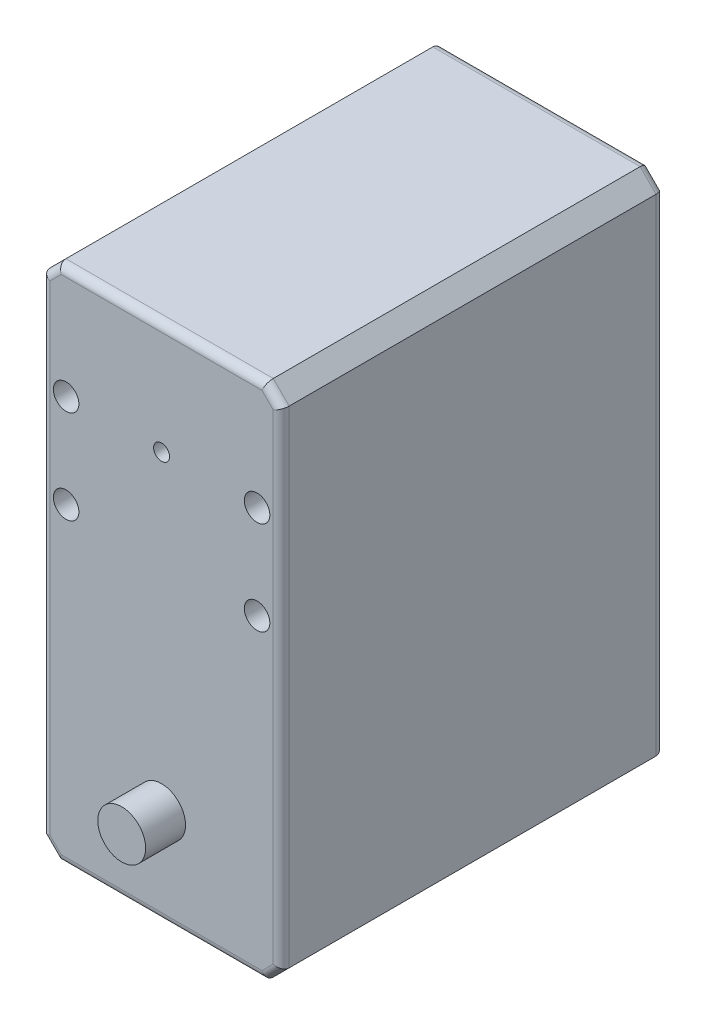
ISO-10303-21;
HEADER;
FILE_DESCRIPTION(('STEP AP214'),'2;1');
FILE_NAME('part.step','',(''),(''),'','','');
FILE_SCHEMA(('AUTOMOTIVE_DESIGN { 1 0 10303 214 1 1 1 1 }'));
ENDSEC;
DATA;
#1=APPLICATION_CONTEXT('core data for automotive mechanical design processes');
#2=APPLICATION_PROTOCOL_DEFINITION('international standard','automotive_design',2000,#1);
#3=PRODUCT_CONTEXT('',#1,'mechanical');
#4=PRODUCT('Part','Part','',(#3));
#5=PRODUCT_RELATED_PRODUCT_CATEGORY('part','',(#4));
#6=PRODUCT_DEFINITION_FORMATION('','',#4);
#7=PRODUCT_DEFINITION_CONTEXT('part definition',#1,'design');
#8=PRODUCT_DEFINITION('design','',#6,#7);
#9=PRODUCT_DEFINITION_SHAPE('','',#8);
#10=(LENGTH_UNIT() NAMED_UNIT(*) SI_UNIT(.MILLI.,.METRE.));
#11=(NAMED_UNIT(*) PLANE_ANGLE_UNIT() SI_UNIT($,.RADIAN.));
#12=(NAMED_UNIT(*) SI_UNIT($,.STERADIAN.) SOLID_ANGLE_UNIT());
#13=UNCERTAINTY_MEASURE_WITH_UNIT(LENGTH_MEASURE(1.E-05),#10,'distance_accuracy_value','');
#14=(GEOMETRIC_REPRESENTATION_CONTEXT(3) GLOBAL_UNCERTAINTY_ASSIGNED_CONTEXT((#13)) GLOBAL_UNIT_ASSIGNED_CONTEXT((#10,
#11,#12)) REPRESENTATION_CONTEXT('',''));
#15=CARTESIAN_POINT('',(0.,0.,0.));
#16=DIRECTION('',(0.,0.,1.));
#17=DIRECTION('',(1.,0.,0.));
#18=AXIS2_PLACEMENT_3D('',#15,#16,#17);
#19=CARTESIAN_POINT('',(0.,0.,48.));
#20=DIRECTION('',(0.,0.,1.));
#21=DIRECTION('',(1.,0.,0.));
#22=AXIS2_PLACEMENT_3D('',#19,#20,#21);
#23=PLANE('',#22);
#24=CARTESIAN_POINT('',(55.9991217398444,57.6069527072445,48.));
#25=DIRECTION('',(0.,0.,1.));
#26=DIRECTION('',(1.,0.,0.));
#27=AXIS2_PLACEMENT_3D('',#24,#25,#26);
#28=CIRCLE('',#27,1.59999999999986);
#29=CARTESIAN_POINT('',(57.5991217398443,57.6069527072445,48.));
#30=VERTEX_POINT('',#29);
#31=EDGE_CURVE('E263',#30,#30,#28,.T.);
#32=ORIENTED_EDGE('',*,*,#31,.F.);
#33=EDGE_LOOP('',(#32));
#34=FACE_BOUND('',#33,.T.);
#35=CARTESIAN_POINT('',(32.0547120458447,57.694813477697,48.));
#36=DIRECTION('',(0.,0.,1.));
#37=DIRECTION('',(1.,0.,0.));
#38=AXIS2_PLACEMENT_3D('',#35,#36,#37);
#39=CIRCLE('',#38,1.59999999999993);
#40=CARTESIAN_POINT('',(33.6547120458447,57.694813477697,48.));
#41=VERTEX_POINT('',#40);
#42=EDGE_CURVE('E742',#41,#41,#39,.T.);
#43=ORIENTED_EDGE('',*,*,#42,.F.);
#44=EDGE_LOOP('',(#43));
#45=FACE_BOUND('',#44,.T.);
#46=CARTESIAN_POINT('',(32.0547120458447,45.9674639761689,48.));
#47=DIRECTION('',(0.,0.,1.));
#48=DIRECTION('',(1.,0.,0.));
#49=AXIS2_PLACEMENT_3D('',#46,#47,#48);
#50=CIRCLE('',#49,1.59999999999993);
#51=CARTESIAN_POINT('',(33.6547120458447,45.9674639761689,48.));
#52=VERTEX_POINT('',#51);
#53=EDGE_CURVE('E745',#52,#52,#50,.T.);
#54=ORIENTED_EDGE('',*,*,#53,.F.);
#55=EDGE_LOOP('',(#54));
#56=FACE_BOUND('',#55,.T.);
#57=CARTESIAN_POINT('',(55.9991217398444,45.8796032057164,48.));
#58=DIRECTION('',(0.,0.,1.));
#59=DIRECTION('',(1.,0.,0.));
#60=AXIS2_PLACEMENT_3D('',#57,#58,#59);
#61=CIRCLE('',#60,1.59999999999986);
#62=CARTESIAN_POINT('',(57.5991217398443,45.8796032057164,48.));
#63=VERTEX_POINT('',#62);
#64=EDGE_CURVE('E748',#63,#63,#61,.T.);
#65=ORIENTED_EDGE('',*,*,#64,.F.);
#66=EDGE_LOOP('',(#65));
#67=FACE_BOUND('',#66,.T.);
#68=DIRECTION('',(-1.,0.,0.));
#69=VECTOR('',#68,1.);
#70=CARTESIAN_POINT('',(31.0269168928446,70.6508830924707,48.));
#71=LINE('',#70,#69);
#72=CARTESIAN_POINT('',(56.6127033304714,70.6508830924707,48.));
#73=VERTEX_POINT('',#72);
#74=CARTESIAN_POINT('',(31.4411304552177,70.6508830924707,48.));
#75=VERTEX_POINT('',#74);
#76=EDGE_CURVE('E191',#73,#75,#71,.T.);
#77=ORIENTED_EDGE('',*,*,#76,.T.);
#78=DIRECTION('',(0.707106781186552,0.707106781186543,0.));
#79=VECTOR('',#78,1.);
#80=CARTESIAN_POINT('',(-19.6048763186268,19.604876318627,48.));
#81=LINE('',#80,#79);
#82=CARTESIAN_POINT('',(30.0269168928446,69.2366695300976,48.));
#83=VERTEX_POINT('',#82);
#84=EDGE_CURVE('E193',#75,#83,#81,.F.);
#85=ORIENTED_EDGE('',*,*,#84,.T.);
#86=DIRECTION('',(0.,-1.,0.));
#87=VECTOR('',#86,1.);
#88=CARTESIAN_POINT('',(30.0269168928446,8.65088309247078,48.));
#89=LINE('',#88,#87);
#90=CARTESIAN_POINT('',(30.0269168928446,9.06509665484388,48.));
#91=VERTEX_POINT('',#90);
#92=EDGE_CURVE('E187',#83,#91,#89,.T.);
#93=ORIENTED_EDGE('',*,*,#92,.T.);
#94=DIRECTION('',(-0.707106781186545,0.70710678118655,0.));
#95=VECTOR('',#94,1.);
#96=CARTESIAN_POINT('',(19.5460067738443,19.5460067738442,48.));
#97=LINE('',#96,#95);
#98=CARTESIAN_POINT('',(31.4411304552177,7.65088309247075,48.));
#99=VERTEX_POINT('',#98);
#100=EDGE_CURVE('E185',#91,#99,#97,.F.);
#101=ORIENTED_EDGE('',*,*,#100,.T.);
#102=DIRECTION('',(1.,0.,0.));
#103=VECTOR('',#102,1.);
#104=CARTESIAN_POINT('',(57.0269168928445,7.65088309247075,48.));
#105=LINE('',#104,#103);
#106=CARTESIAN_POINT('',(56.6127033304715,7.65088309247075,48.));
#107=VERTEX_POINT('',#106);
#108=EDGE_CURVE('E157',#99,#107,#105,.T.);
#109=ORIENTED_EDGE('',*,*,#108,.T.);
#110=DIRECTION('',(-0.70710678118655,-0.707106781186545,0.));
#111=VECTOR('',#110,1.);
#112=CARTESIAN_POINT('',(24.4809101190002,-24.4809101190003,48.));
#113=LINE('',#112,#111);
#114=CARTESIAN_POINT('',(58.0269168928446,9.06509665484385,48.));
#115=VERTEX_POINT('',#114);
#116=EDGE_CURVE('E150',#107,#115,#113,.F.);
#117=ORIENTED_EDGE('',*,*,#116,.T.);
#118=DIRECTION('',(0.,1.,0.));
#119=VECTOR('',#118,1.);
#120=CARTESIAN_POINT('',(58.0269168928446,69.6508830924707,48.));
#121=LINE('',#120,#119);
#122=CARTESIAN_POINT('',(58.0269168928446,69.2366695300976,48.));
#123=VERTEX_POINT('',#122);
#124=EDGE_CURVE('E154',#115,#123,#121,.T.);
#125=ORIENTED_EDGE('',*,*,#124,.T.);
#126=DIRECTION('',(0.707106781186545,-0.70710678118655,0.));
#127=VECTOR('',#126,1.);
#128=CARTESIAN_POINT('',(63.6317932114713,63.6317932114709,48.));
#129=LINE('',#128,#127);
#130=EDGE_CURVE('E189',#123,#73,#129,.F.);
#131=ORIENTED_EDGE('',*,*,#130,.T.);
#132=EDGE_LOOP('',(#77,#85,#93,#101,#109,#117,#125,#131));
#133=FACE_BOUND('',#132,.T.);
#134=CARTESIAN_POINT('',(44.0269168928446,18.6508830924708,48.));
#135=DIRECTION('',(0.,0.,1.));
#136=DIRECTION('',(1.,0.,0.));
#137=AXIS2_PLACEMENT_3D('',#134,#135,#136);
#138=CIRCLE('',#137,3.);
#139=CARTESIAN_POINT('',(47.0269168928446,18.6508830924708,48.));
#140=VERTEX_POINT('',#139);
#141=EDGE_CURVE('E305',#140,#140,#138,.T.);
#142=ORIENTED_EDGE('',*,*,#141,.F.);
#143=EDGE_LOOP('',(#142));
#144=FACE_BOUND('',#143,.T.);
#145=CARTESIAN_POINT('',(44.0269168928446,57.6508830924708,48.));
#146=DIRECTION('',(0.,0.,1.));
#147=DIRECTION('',(1.,0.,0.));
#148=AXIS2_PLACEMENT_3D('',#145,#146,#147);
#149=CIRCLE('',#148,0.999999999999998);
#150=CARTESIAN_POINT('',(45.0269168928446,57.6508830924708,48.));
#151=VERTEX_POINT('',#150);
#152=EDGE_CURVE('E719',#151,#151,#149,.T.);
#153=ORIENTED_EDGE('',*,*,#152,.F.);
#154=EDGE_LOOP('',(#153));
#155=FACE_BOUND('',#154,.T.);
#156=ADVANCED_FACE('F36',(#34,#45,#56,#67,#133,#144,#155),#23,.T.);
#157=CARTESIAN_POINT('',(0.,0.,0.));
#158=DIRECTION('',(0.,0.,1.));
#159=DIRECTION('',(1.,0.,0.));
#160=AXIS2_PLACEMENT_3D('',#157,#158,#159);
#161=PLANE('',#160);
#162=CARTESIAN_POINT('',(55.9991217398444,57.6069527072445,0.));
#163=DIRECTION('',(0.,0.,-1.));
#164=DIRECTION('',(-1.,0.,0.));
#165=AXIS2_PLACEMENT_3D('',#162,#163,#164);
#166=CIRCLE('',#165,1.59999999999986);
#167=CARTESIAN_POINT('',(54.3991217398445,57.6069527072445,0.));
#168=VERTEX_POINT('',#167);
#169=EDGE_CURVE('E755',#168,#168,#166,.T.);
#170=ORIENTED_EDGE('',*,*,#169,.F.);
#171=EDGE_LOOP('',(#170));
#172=FACE_BOUND('',#171,.T.);
#173=CARTESIAN_POINT('',(32.0547120458447,57.694813477697,0.));
#174=DIRECTION('',(0.,0.,-1.));
#175=DIRECTION('',(-1.,0.,0.));
#176=AXIS2_PLACEMENT_3D('',#173,#174,#175);
#177=CIRCLE('',#176,1.59999999999993);
#178=CARTESIAN_POINT('',(30.4547120458448,57.694813477697,0.));
#179=VERTEX_POINT('',#178);
#180=EDGE_CURVE('E758',#179,#179,#177,.T.);
#181=ORIENTED_EDGE('',*,*,#180,.F.);
#182=EDGE_LOOP('',(#181));
#183=FACE_BOUND('',#182,.T.);
#184=CARTESIAN_POINT('',(32.0547120458447,45.9674639761689,0.));
#185=DIRECTION('',(0.,0.,-1.));
#186=DIRECTION('',(-1.,0.,0.));
#187=AXIS2_PLACEMENT_3D('',#184,#185,#186);
#188=CIRCLE('',#187,1.59999999999993);
#189=CARTESIAN_POINT('',(30.4547120458448,45.9674639761689,0.));
#190=VERTEX_POINT('',#189);
#191=EDGE_CURVE('E754',#190,#190,#188,.T.);
#192=ORIENTED_EDGE('',*,*,#191,.F.);
#193=EDGE_LOOP('',(#192));
#194=FACE_BOUND('',#193,.T.);
#195=CARTESIAN_POINT('',(55.9991217398444,45.8796032057164,0.));
#196=DIRECTION('',(0.,0.,-1.));
#197=DIRECTION('',(-1.,0.,0.));
#198=AXIS2_PLACEMENT_3D('',#195,#196,#197);
#199=CIRCLE('',#198,1.59999999999986);
#200=CARTESIAN_POINT('',(54.3991217398445,45.8796032057164,0.));
#201=VERTEX_POINT('',#200);
#202=EDGE_CURVE('E751',#201,#201,#199,.T.);
#203=ORIENTED_EDGE('',*,*,#202,.F.);
#204=EDGE_LOOP('',(#203));
#205=FACE_BOUND('',#204,.T.);
#206=DIRECTION('',(-0.707106781186552,-0.707106781186543,0.));
#207=VECTOR('',#206,1.);
#208=CARTESIAN_POINT('',(31.7340236740311,70.9437763112842,0.));
#209=LINE('',#208,#207);
#210=CARTESIAN_POINT('',(30.0269168928446,69.2366695300977,0.));
#211=VERTEX_POINT('',#210);
#212=CARTESIAN_POINT('',(31.4411304552177,70.6508830924707,0.));
#213=VERTEX_POINT('',#212);
#214=EDGE_CURVE('E240',#211,#213,#209,.F.);
#215=ORIENTED_EDGE('',*,*,#214,.T.);
#216=DIRECTION('',(-1.,0.,0.));
#217=VECTOR('',#216,1.);
#218=CARTESIAN_POINT('',(0.,70.6508830924707,0.));
#219=LINE('',#218,#217);
#220=CARTESIAN_POINT('',(56.6127033304714,70.6508830924707,0.));
#221=VERTEX_POINT('',#220);
#222=EDGE_CURVE('E245',#213,#221,#219,.F.);
#223=ORIENTED_EDGE('',*,*,#222,.T.);
#224=DIRECTION('',(-0.707106781186545,0.70710678118655,0.));
#225=VECTOR('',#224,1.);
#226=CARTESIAN_POINT('',(58.319810111658,68.9437763112842,0.));
#227=LINE('',#226,#225);
#228=CARTESIAN_POINT('',(58.0269168928446,69.2366695300976,0.));
#229=VERTEX_POINT('',#228);
#230=EDGE_CURVE('E242',#221,#229,#227,.F.);
#231=ORIENTED_EDGE('',*,*,#230,.T.);
#232=DIRECTION('',(0.,1.,0.));
#233=VECTOR('',#232,1.);
#234=CARTESIAN_POINT('',(58.0269168928446,0.,0.));
#235=LINE('',#234,#233);
#236=CARTESIAN_POINT('',(58.0269168928446,9.06509665484385,0.));
#237=VERTEX_POINT('',#236);
#238=EDGE_CURVE('E214',#229,#237,#235,.F.);
#239=ORIENTED_EDGE('',*,*,#238,.T.);
#240=DIRECTION('',(0.70710678118655,0.707106781186545,0.));
#241=VECTOR('',#240,1.);
#242=CARTESIAN_POINT('',(56.319810111658,7.3579898736573,0.));
#243=LINE('',#242,#241);
#244=CARTESIAN_POINT('',(56.6127033304715,7.65088309247075,0.));
#245=VERTEX_POINT('',#244);
#246=EDGE_CURVE('E232',#237,#245,#243,.F.);
#247=ORIENTED_EDGE('',*,*,#246,.T.);
#248=DIRECTION('',(1.,0.,0.));
#249=VECTOR('',#248,1.);
#250=CARTESIAN_POINT('',(0.,7.65088309247075,0.));
#251=LINE('',#250,#249);
#252=CARTESIAN_POINT('',(31.4411304552177,7.65088309247075,0.));
#253=VERTEX_POINT('',#252);
#254=EDGE_CURVE('E234',#245,#253,#251,.F.);
#255=ORIENTED_EDGE('',*,*,#254,.T.);
#256=DIRECTION('',(0.707106781186545,-0.70710678118655,0.));
#257=VECTOR('',#256,1.);
#258=CARTESIAN_POINT('',(29.7340236740311,9.35798987365733,0.));
#259=LINE('',#258,#257);
#260=CARTESIAN_POINT('',(30.0269168928446,9.06509665484388,0.));
#261=VERTEX_POINT('',#260);
#262=EDGE_CURVE('E236',#253,#261,#259,.F.);
#263=ORIENTED_EDGE('',*,*,#262,.T.);
#264=DIRECTION('',(0.,-1.,0.));
#265=VECTOR('',#264,1.);
#266=CARTESIAN_POINT('',(30.0269168928446,0.,0.));
#267=LINE('',#266,#265);
#268=EDGE_CURVE('E238',#261,#211,#267,.F.);
#269=ORIENTED_EDGE('',*,*,#268,.T.);
#270=EDGE_LOOP('',(#215,#223,#231,#239,#247,#255,#263,#269));
#271=FACE_BOUND('',#270,.T.);
#272=CARTESIAN_POINT('',(44.0269168928446,18.6508830924708,0.));
#273=DIRECTION('',(0.,0.,1.));
#274=DIRECTION('',(1.,0.,0.));
#275=AXIS2_PLACEMENT_3D('',#272,#273,#274);
#276=CIRCLE('',#275,3.);
#277=CARTESIAN_POINT('',(47.0269168928446,18.6508830924708,0.));
#278=VERTEX_POINT('',#277);
#279=EDGE_CURVE('E727',#278,#278,#276,.T.);
#280=ORIENTED_EDGE('',*,*,#279,.T.);
#281=EDGE_LOOP('',(#280));
#282=FACE_BOUND('',#281,.T.);
#283=CARTESIAN_POINT('',(44.0269168928446,57.6508830924708,0.));
#284=DIRECTION('',(0.,0.,1.));
#285=DIRECTION('',(1.,0.,0.));
#286=AXIS2_PLACEMENT_3D('',#283,#284,#285);
#287=CIRCLE('',#286,0.999999999999998);
#288=CARTESIAN_POINT('',(45.0269168928446,57.6508830924708,0.));
#289=VERTEX_POINT('',#288);
#290=EDGE_CURVE('E722',#289,#289,#287,.T.);
#291=ORIENTED_EDGE('',*,*,#290,.T.);
#292=EDGE_LOOP('',(#291));
#293=FACE_BOUND('',#292,.T.);
#294=ADVANCED_FACE('F367',(#172,#183,#194,#205,#271,#282,#293),#161,.F.);
#295=CARTESIAN_POINT('',(29.0269168928446,6.65088309247075,48.));
#296=DIRECTION('',(1.,0.,0.));
#297=DIRECTION('',(0.,0.,-1.));
#298=AXIS2_PLACEMENT_3D('',#295,#296,#297);
#299=PLANE('',#298);
#300=DIRECTION('',(0.,0.,-1.));
#301=VECTOR('',#300,1.);
#302=CARTESIAN_POINT('',(29.0269168928446,69.6508830924707,48.));
#303=LINE('',#302,#301);
#304=CARTESIAN_POINT('',(29.0269168928446,69.6508830924707,47.));
#305=VERTEX_POINT('',#304);
#306=CARTESIAN_POINT('',(29.0269168928446,69.6508830924707,1.));
#307=VERTEX_POINT('',#306);
#308=EDGE_CURVE('E300',#305,#307,#303,.T.);
#309=ORIENTED_EDGE('',*,*,#308,.T.);
#310=DIRECTION('',(0.,-1.,0.));
#311=VECTOR('',#310,1.);
#312=CARTESIAN_POINT('',(29.0269168928446,6.65088309247075,1.));
#313=LINE('',#312,#311);
#314=CARTESIAN_POINT('',(29.0269168928446,8.65088309247078,1.));
#315=VERTEX_POINT('',#314);
#316=EDGE_CURVE('E254',#307,#315,#313,.T.);
#317=ORIENTED_EDGE('',*,*,#316,.T.);
#318=DIRECTION('',(0.,0.,1.));
#319=VECTOR('',#318,1.);
#320=CARTESIAN_POINT('',(29.0269168928446,8.65088309247078,48.));
#321=LINE('',#320,#319);
#322=CARTESIAN_POINT('',(29.0269168928446,8.65088309247078,47.));
#323=VERTEX_POINT('',#322);
#324=EDGE_CURVE('E297',#315,#323,#321,.T.);
#325=ORIENTED_EDGE('',*,*,#324,.T.);
#326=DIRECTION('',(0.,-1.,0.));
#327=VECTOR('',#326,1.);
#328=CARTESIAN_POINT('',(29.0269168928446,69.6508830924707,47.));
#329=LINE('',#328,#327);
#330=EDGE_CURVE('E204',#323,#305,#329,.F.);
#331=ORIENTED_EDGE('',*,*,#330,.T.);
#332=EDGE_LOOP('',(#309,#317,#325,#331));
#333=FACE_BOUND('',#332,.T.);
#334=ADVANCED_FACE('F334',(#333),#299,.F.);
#335=CARTESIAN_POINT('',(29.0269168928446,6.65088309247075,48.));
#336=DIRECTION('',(0.,1.,0.));
#337=DIRECTION('',(0.,0.,1.));
#338=AXIS2_PLACEMENT_3D('',#335,#336,#337);
#339=PLANE('',#338);
#340=DIRECTION('',(0.,0.,-1.));
#341=VECTOR('',#340,1.);
#342=CARTESIAN_POINT('',(31.0269168928446,6.65088309247075,48.));
#343=LINE('',#342,#341);
#344=CARTESIAN_POINT('',(31.0269168928446,6.65088309247075,47.));
#345=VERTEX_POINT('',#344);
#346=CARTESIAN_POINT('',(31.0269168928446,6.65088309247075,1.));
#347=VERTEX_POINT('',#346);
#348=EDGE_CURVE('E295',#345,#347,#343,.T.);
#349=ORIENTED_EDGE('',*,*,#348,.T.);
#350=DIRECTION('',(1.,0.,0.));
#351=VECTOR('',#350,1.);
#352=CARTESIAN_POINT('',(29.0269168928446,6.65088309247075,1.));
#353=LINE('',#352,#351);
#354=CARTESIAN_POINT('',(57.0269168928445,6.65088309247075,1.));
#355=VERTEX_POINT('',#354);
#356=EDGE_CURVE('E60',#347,#355,#353,.T.);
#357=ORIENTED_EDGE('',*,*,#356,.T.);
#358=DIRECTION('',(0.,0.,1.));
#359=VECTOR('',#358,1.);
#360=CARTESIAN_POINT('',(57.0269168928445,6.65088309247075,48.));
#361=LINE('',#360,#359);
#362=CARTESIAN_POINT('',(57.0269168928445,6.65088309247075,47.));
#363=VERTEX_POINT('',#362);
#364=EDGE_CURVE('E301',#355,#363,#361,.T.);
#365=ORIENTED_EDGE('',*,*,#364,.T.);
#366=DIRECTION('',(1.,0.,0.));
#367=VECTOR('',#366,1.);
#368=CARTESIAN_POINT('',(31.0269168928446,6.65088309247075,47.));
#369=LINE('',#368,#367);
#370=EDGE_CURVE('E209',#363,#345,#369,.F.);
#371=ORIENTED_EDGE('',*,*,#370,.T.);
#372=EDGE_LOOP('',(#349,#357,#365,#371));
#373=FACE_BOUND('',#372,.T.);
#374=ADVANCED_FACE('F298',(#373),#339,.F.);
#375=CARTESIAN_POINT('',(59.0269168928446,6.65088309247075,48.));
#376=DIRECTION('',(-1.,0.,0.));
#377=DIRECTION('',(0.,0.,1.));
#378=AXIS2_PLACEMENT_3D('',#375,#376,#377);
#379=PLANE('',#378);
#380=DIRECTION('',(0.,0.,-1.));
#381=VECTOR('',#380,1.);
#382=CARTESIAN_POINT('',(59.0269168928446,8.65088309247075,48.));
#383=LINE('',#382,#381);
#384=CARTESIAN_POINT('',(59.0269168928446,8.65088309247075,47.));
#385=VERTEX_POINT('',#384);
#386=CARTESIAN_POINT('',(59.0269168928446,8.65088309247075,1.));
#387=VERTEX_POINT('',#386);
#388=EDGE_CURVE('E312',#385,#387,#383,.T.);
#389=ORIENTED_EDGE('',*,*,#388,.T.);
#390=DIRECTION('',(0.,1.,0.));
#391=VECTOR('',#390,1.);
#392=CARTESIAN_POINT('',(59.0269168928446,6.65088309247075,1.));
#393=LINE('',#392,#391);
#394=CARTESIAN_POINT('',(59.0269168928446,69.6508830924707,1.));
#395=VERTEX_POINT('',#394);
#396=EDGE_CURVE('E11',#387,#395,#393,.T.);
#397=ORIENTED_EDGE('',*,*,#396,.T.);
#398=DIRECTION('',(0.,0.,1.));
#399=VECTOR('',#398,1.);
#400=CARTESIAN_POINT('',(59.0269168928446,69.6508830924707,48.));
#401=LINE('',#400,#399);
#402=CARTESIAN_POINT('',(59.0269168928446,69.6508830924707,47.));
#403=VERTEX_POINT('',#402);
#404=EDGE_CURVE('E310',#395,#403,#401,.T.);
#405=ORIENTED_EDGE('',*,*,#404,.T.);
#406=DIRECTION('',(0.,1.,0.));
#407=VECTOR('',#406,1.);
#408=CARTESIAN_POINT('',(59.0269168928446,8.65088309247075,47.));
#409=LINE('',#408,#407);
#410=EDGE_CURVE('E212',#403,#385,#409,.F.);
#411=ORIENTED_EDGE('',*,*,#410,.T.);
#412=EDGE_LOOP('',(#389,#397,#405,#411));
#413=FACE_BOUND('',#412,.T.);
#414=ADVANCED_FACE('F349',(#413),#379,.F.);
#415=CARTESIAN_POINT('',(59.0269168928446,71.6508830924707,48.));
#416=DIRECTION('',(0.,-1.,0.));
#417=DIRECTION('',(0.,0.,-1.));
#418=AXIS2_PLACEMENT_3D('',#415,#416,#417);
#419=PLANE('',#418);
#420=DIRECTION('',(0.,0.,-1.));
#421=VECTOR('',#420,1.);
#422=CARTESIAN_POINT('',(57.0269168928445,71.6508830924707,48.));
#423=LINE('',#422,#421);
#424=CARTESIAN_POINT('',(57.0269168928445,71.6508830924707,47.));
#425=VERTEX_POINT('',#424);
#426=CARTESIAN_POINT('',(57.0269168928445,71.6508830924707,1.));
#427=VERTEX_POINT('',#426);
#428=EDGE_CURVE('E177',#425,#427,#423,.T.);
#429=ORIENTED_EDGE('',*,*,#428,.T.);
#430=DIRECTION('',(-1.,0.,0.));
#431=VECTOR('',#430,1.);
#432=CARTESIAN_POINT('',(59.0269168928446,71.6508830924707,1.));
#433=LINE('',#432,#431);
#434=CARTESIAN_POINT('',(31.0269168928446,71.6508830924707,1.));
#435=VERTEX_POINT('',#434);
#436=EDGE_CURVE('E252',#427,#435,#433,.T.);
#437=ORIENTED_EDGE('',*,*,#436,.T.);
#438=DIRECTION('',(0.,0.,1.));
#439=VECTOR('',#438,1.);
#440=CARTESIAN_POINT('',(31.0269168928446,71.6508830924707,48.));
#441=LINE('',#440,#439);
#442=CARTESIAN_POINT('',(31.0269168928446,71.6508830924707,47.));
#443=VERTEX_POINT('',#442);
#444=EDGE_CURVE('E180',#435,#443,#441,.T.);
#445=ORIENTED_EDGE('',*,*,#444,.T.);
#446=DIRECTION('',(-1.,0.,0.));
#447=VECTOR('',#446,1.);
#448=CARTESIAN_POINT('',(57.0269168928445,71.6508830924707,47.));
#449=LINE('',#448,#447);
#450=EDGE_CURVE('E199',#443,#425,#449,.F.);
#451=ORIENTED_EDGE('',*,*,#450,.T.);
#452=EDGE_LOOP('',(#429,#437,#445,#451));
#453=FACE_BOUND('',#452,.T.);
#454=ADVANCED_FACE('F315',(#453),#419,.F.);
#455=CARTESIAN_POINT('',(44.0269168928446,57.6508830924708,48.));
#456=DIRECTION('',(0.,0.,-1.));
#457=DIRECTION('',(-1.,0.,0.));
#458=AXIS2_PLACEMENT_3D('',#455,#456,#457);
#459=CYLINDRICAL_SURFACE('',#458,0.999999999999998);
#460=ORIENTED_EDGE('',*,*,#152,.T.);
#461=EDGE_LOOP('',(#460));
#462=FACE_BOUND('',#461,.T.);
#463=ORIENTED_EDGE('',*,*,#290,.F.);
#464=EDGE_LOOP('',(#463));
#465=FACE_BOUND('',#464,.T.);
#466=ADVANCED_FACE('F378',(#462,#465),#459,.F.);
#467=CARTESIAN_POINT('',(44.0269168928446,18.6508830924708,-5.));
#468=DIRECTION('',(0.,0.,-1.));
#469=DIRECTION('',(-1.,0.,0.));
#470=AXIS2_PLACEMENT_3D('',#467,#468,#469);
#471=PLANE('',#470);
#472=CARTESIAN_POINT('',(44.0269168928446,18.6508830924708,-5.));
#473=DIRECTION('',(0.,0.,-1.));
#474=DIRECTION('',(-1.,0.,0.));
#475=AXIS2_PLACEMENT_3D('',#472,#473,#474);
#476=CIRCLE('',#475,3.);
#477=CARTESIAN_POINT('',(41.0269168928446,18.6508830924708,-5.));
#478=VERTEX_POINT('',#477);
#479=EDGE_CURVE('E170',#478,#478,#476,.T.);
#480=ORIENTED_EDGE('',*,*,#479,.T.);
#481=EDGE_LOOP('',(#480));
#482=FACE_BOUND('',#481,.T.);
#483=ADVANCED_FACE('F692',(#482),#471,.T.);
#484=CARTESIAN_POINT('',(44.0269168928446,18.6508830924708,53.));
#485=DIRECTION('',(0.,0.,-1.));
#486=DIRECTION('',(-1.,0.,0.));
#487=AXIS2_PLACEMENT_3D('',#484,#485,#486);
#488=CYLINDRICAL_SURFACE('',#487,3.);
#489=ORIENTED_EDGE('',*,*,#479,.F.);
#490=EDGE_LOOP('',(#489));
#491=FACE_BOUND('',#490,.T.);
#492=ORIENTED_EDGE('',*,*,#279,.F.);
#493=EDGE_LOOP('',(#492));
#494=FACE_BOUND('',#493,.T.);
#495=ADVANCED_FACE('F683',(#491,#494),#488,.T.);
#496=ORIENTED_EDGE('',*,*,#141,.T.);
#497=EDGE_LOOP('',(#496));
#498=FACE_BOUND('',#497,.T.);
#499=CARTESIAN_POINT('',(44.0269168928446,18.6508830924708,53.));
#500=DIRECTION('',(0.,0.,-1.));
#501=DIRECTION('',(-1.,0.,0.));
#502=AXIS2_PLACEMENT_3D('',#499,#500,#501);
#503=CIRCLE('',#502,3.);
#504=CARTESIAN_POINT('',(41.0269168928446,18.6508830924708,53.));
#505=VERTEX_POINT('',#504);
#506=EDGE_CURVE('E731',#505,#505,#503,.T.);
#507=ORIENTED_EDGE('',*,*,#506,.T.);
#508=EDGE_LOOP('',(#507));
#509=FACE_BOUND('',#508,.T.);
#510=ADVANCED_FACE('F672',(#498,#509),#488,.T.);
#511=CARTESIAN_POINT('',(44.0269168928446,18.6508830924708,53.));
#512=DIRECTION('',(0.,0.,-1.));
#513=DIRECTION('',(-1.,0.,0.));
#514=AXIS2_PLACEMENT_3D('',#511,#512,#513);
#515=PLANE('',#514);
#516=ORIENTED_EDGE('',*,*,#506,.F.);
#517=EDGE_LOOP('',(#516));
#518=FACE_BOUND('',#517,.T.);
#519=ADVANCED_FACE('F395',(#518),#515,.F.);
#520=CARTESIAN_POINT('',(31.0269168928446,6.65088309247075,48.));
#521=DIRECTION('',(0.70710678118655,0.707106781186545,0.));
#522=DIRECTION('',(0.,0.,-1.));
#523=AXIS2_PLACEMENT_3D('',#520,#521,#522);
#524=PLANE('',#523);
#525=ORIENTED_EDGE('',*,*,#324,.F.);
#526=DIRECTION('',(-0.707106781186545,0.70710678118655,0.));
#527=VECTOR('',#526,1.);
#528=CARTESIAN_POINT('',(31.0269168928446,6.65088309247075,1.));
#529=LINE('',#528,#527);
#530=EDGE_CURVE('E256',#315,#347,#529,.F.);
#531=ORIENTED_EDGE('',*,*,#530,.T.);
#532=ORIENTED_EDGE('',*,*,#348,.F.);
#533=DIRECTION('',(0.707106781186545,-0.70710678118655,0.));
#534=VECTOR('',#533,1.);
#535=CARTESIAN_POINT('',(31.0269168928446,6.65088309247075,47.));
#536=LINE('',#535,#534);
#537=EDGE_CURVE('E206',#345,#323,#536,.F.);
#538=ORIENTED_EDGE('',*,*,#537,.T.);
#539=EDGE_LOOP('',(#525,#531,#532,#538));
#540=FACE_BOUND('',#539,.T.);
#541=ADVANCED_FACE('F294',(#540),#524,.F.);
#542=CARTESIAN_POINT('',(59.0269168928446,8.65088309247075,48.));
#543=DIRECTION('',(-0.707106781186545,0.70710678118655,0.));
#544=DIRECTION('',(0.,0.,-1.));
#545=AXIS2_PLACEMENT_3D('',#542,#543,#544);
#546=PLANE('',#545);
#547=ORIENTED_EDGE('',*,*,#364,.F.);
#548=DIRECTION('',(-0.70710678118655,-0.707106781186545,0.));
#549=VECTOR('',#548,1.);
#550=CARTESIAN_POINT('',(59.0269168928446,8.65088309247075,1.));
#551=LINE('',#550,#549);
#552=EDGE_CURVE('E45',#355,#387,#551,.F.);
#553=ORIENTED_EDGE('',*,*,#552,.T.);
#554=ORIENTED_EDGE('',*,*,#388,.F.);
#555=DIRECTION('',(0.70710678118655,0.707106781186545,0.));
#556=VECTOR('',#555,1.);
#557=CARTESIAN_POINT('',(59.0269168928446,8.65088309247075,47.));
#558=LINE('',#557,#556);
#559=EDGE_CURVE('E167',#385,#363,#558,.F.);
#560=ORIENTED_EDGE('',*,*,#559,.T.);
#561=EDGE_LOOP('',(#547,#553,#554,#560));
#562=FACE_BOUND('',#561,.T.);
#563=ADVANCED_FACE('F351',(#562),#546,.F.);
#564=CARTESIAN_POINT('',(57.0269168928445,71.6508830924707,48.));
#565=DIRECTION('',(-0.70710678118655,-0.707106781186545,0.));
#566=DIRECTION('',(0.,0.,-1.));
#567=AXIS2_PLACEMENT_3D('',#564,#565,#566);
#568=PLANE('',#567);
#569=ORIENTED_EDGE('',*,*,#404,.F.);
#570=DIRECTION('',(0.707106781186545,-0.70710678118655,0.));
#571=VECTOR('',#570,1.);
#572=CARTESIAN_POINT('',(57.0269168928445,71.6508830924707,1.));
#573=LINE('',#572,#571);
#574=EDGE_CURVE('E247',#395,#427,#573,.F.);
#575=ORIENTED_EDGE('',*,*,#574,.T.);
#576=ORIENTED_EDGE('',*,*,#428,.F.);
#577=DIRECTION('',(-0.707106781186545,0.70710678118655,0.));
#578=VECTOR('',#577,1.);
#579=CARTESIAN_POINT('',(57.0269168928445,71.6508830924707,47.));
#580=LINE('',#579,#578);
#581=EDGE_CURVE('E201',#425,#403,#580,.F.);
#582=ORIENTED_EDGE('',*,*,#581,.T.);
#583=EDGE_LOOP('',(#569,#575,#576,#582));
#584=FACE_BOUND('',#583,.T.);
#585=ADVANCED_FACE('F346',(#584),#568,.F.);
#586=CARTESIAN_POINT('',(29.0269168928446,69.6508830924707,48.));
#587=DIRECTION('',(0.707106781186542,-0.707106781186552,0.));
#588=DIRECTION('',(0.,0.,-1.));
#589=AXIS2_PLACEMENT_3D('',#586,#587,#588);
#590=PLANE('',#589);
#591=ORIENTED_EDGE('',*,*,#444,.F.);
#592=DIRECTION('',(0.707106781186552,0.707106781186543,0.));
#593=VECTOR('',#592,1.);
#594=CARTESIAN_POINT('',(29.0269168928446,69.6508830924707,1.));
#595=LINE('',#594,#593);
#596=EDGE_CURVE('E250',#435,#307,#595,.F.);
#597=ORIENTED_EDGE('',*,*,#596,.T.);
#598=ORIENTED_EDGE('',*,*,#308,.F.);
#599=DIRECTION('',(-0.707106781186552,-0.707106781186543,0.));
#600=VECTOR('',#599,1.);
#601=CARTESIAN_POINT('',(29.0269168928446,69.6508830924707,47.));
#602=LINE('',#601,#600);
#603=EDGE_CURVE('E196',#305,#443,#602,.F.);
#604=ORIENTED_EDGE('',*,*,#603,.T.);
#605=EDGE_LOOP('',(#591,#597,#598,#604));
#606=FACE_BOUND('',#605,.T.);
#607=ADVANCED_FACE('F332',(#606),#590,.F.);
#608=CARTESIAN_POINT('',(24.4809101190002,-24.4809101190003,47.));
#609=DIRECTION('',(-0.70710678118655,-0.707106781186545,0.));
#610=DIRECTION('',(0.707106781186545,-0.70710678118655,0.));
#611=AXIS2_PLACEMENT_3D('',#608,#609,#610);
#612=CYLINDRICAL_SURFACE('',#611,1.);
#613=CARTESIAN_POINT('',(56.6127033304714,7.65088309247075,47.));
#614=DIRECTION('',(-0.923879532511287,-0.382683432365088,0.));
#615=DIRECTION('',(0.382683432365088,-0.923879532511287,0.));
#616=AXIS2_PLACEMENT_3D('',#613,#614,#615);
#617=ELLIPSE('',#616,1.08239220029239,1.);
#618=EDGE_CURVE('E171',#363,#107,#617,.T.);
#619=ORIENTED_EDGE('',*,*,#618,.F.);
#620=ORIENTED_EDGE('',*,*,#559,.F.);
#621=CARTESIAN_POINT('',(58.0269168928446,9.06509665484386,47.));
#622=DIRECTION('',(-0.382683432365091,-0.923879532511286,0.));
#623=DIRECTION('',(0.923879532511286,-0.382683432365091,0.));
#624=AXIS2_PLACEMENT_3D('',#621,#622,#623);
#625=ELLIPSE('',#624,1.08239220029239,1.);
#626=EDGE_CURVE('E164',#115,#385,#625,.F.);
#627=ORIENTED_EDGE('',*,*,#626,.F.);
#628=ORIENTED_EDGE('',*,*,#116,.F.);
#629=EDGE_LOOP('',(#619,#620,#627,#628));
#630=FACE_BOUND('',#629,.T.);
#631=ADVANCED_FACE('F165',(#630),#612,.T.);
#632=CARTESIAN_POINT('',(58.0269168928446,0.,47.));
#633=DIRECTION('',(0.,-1.,0.));
#634=DIRECTION('',(0.,0.,-1.));
#635=AXIS2_PLACEMENT_3D('',#632,#633,#634);
#636=CYLINDRICAL_SURFACE('',#635,1.);
#637=ORIENTED_EDGE('',*,*,#626,.T.);
#638=ORIENTED_EDGE('',*,*,#410,.F.);
#639=CARTESIAN_POINT('',(58.0269168928446,69.2366695300976,47.));
#640=DIRECTION('',(0.382683432365088,-0.923879532511287,0.));
#641=DIRECTION('',(-0.923879532511287,-0.382683432365088,0.));
#642=AXIS2_PLACEMENT_3D('',#639,#640,#641);
#643=ELLIPSE('',#642,1.08239220029239,1.);
#644=EDGE_CURVE('E175',#123,#403,#643,.F.);
#645=ORIENTED_EDGE('',*,*,#644,.F.);
#646=ORIENTED_EDGE('',*,*,#124,.F.);
#647=EDGE_LOOP('',(#637,#638,#645,#646));
#648=FACE_BOUND('',#647,.T.);
#649=ADVANCED_FACE('F173',(#648),#636,.T.);
#650=CARTESIAN_POINT('',(0.,7.65088309247075,47.));
#651=DIRECTION('',(-1.,0.,0.));
#652=DIRECTION('',(0.,0.,1.));
#653=AXIS2_PLACEMENT_3D('',#650,#651,#652);
#654=CYLINDRICAL_SURFACE('',#653,1.);
#655=ORIENTED_EDGE('',*,*,#618,.T.);
#656=ORIENTED_EDGE('',*,*,#108,.F.);
#657=CARTESIAN_POINT('',(31.4411304552177,7.65088309247075,47.));
#658=DIRECTION('',(-0.923879532511286,0.382683432365092,0.));
#659=DIRECTION('',(-0.382683432365091,-0.923879532511286,0.));
#660=AXIS2_PLACEMENT_3D('',#657,#658,#659);
#661=ELLIPSE('',#660,1.08239220029239,1.);
#662=EDGE_CURVE('E226',#345,#99,#661,.T.);
#663=ORIENTED_EDGE('',*,*,#662,.F.);
#664=ORIENTED_EDGE('',*,*,#370,.F.);
#665=EDGE_LOOP('',(#655,#656,#663,#664));
#666=FACE_BOUND('',#665,.T.);
#667=ADVANCED_FACE('F354',(#666),#654,.T.);
#668=CARTESIAN_POINT('',(63.6317932114713,63.6317932114708,47.));
#669=DIRECTION('',(0.707106781186545,-0.70710678118655,0.));
#670=DIRECTION('',(0.70710678118655,0.707106781186545,0.));
#671=AXIS2_PLACEMENT_3D('',#668,#669,#670);
#672=CYLINDRICAL_SURFACE('',#671,1.);
#673=ORIENTED_EDGE('',*,*,#644,.T.);
#674=ORIENTED_EDGE('',*,*,#581,.F.);
#675=CARTESIAN_POINT('',(56.6127033304714,70.6508830924707,47.));
#676=DIRECTION('',(0.923879532511286,-0.382683432365091,0.));
#677=DIRECTION('',(-0.382683432365091,-0.923879532511286,0.));
#678=AXIS2_PLACEMENT_3D('',#675,#676,#677);
#679=ELLIPSE('',#678,1.08239220029239,1.);
#680=EDGE_CURVE('E223',#73,#425,#679,.F.);
#681=ORIENTED_EDGE('',*,*,#680,.F.);
#682=ORIENTED_EDGE('',*,*,#130,.F.);
#683=EDGE_LOOP('',(#673,#674,#681,#682));
#684=FACE_BOUND('',#683,.T.);
#685=ADVANCED_FACE('F343',(#684),#672,.T.);
#686=CARTESIAN_POINT('',(19.5460067738443,19.5460067738442,47.));
#687=DIRECTION('',(-0.707106781186545,0.70710678118655,0.));
#688=DIRECTION('',(-0.70710678118655,-0.707106781186545,0.));
#689=AXIS2_PLACEMENT_3D('',#686,#687,#688);
#690=CYLINDRICAL_SURFACE('',#689,1.);
#691=ORIENTED_EDGE('',*,*,#662,.T.);
#692=ORIENTED_EDGE('',*,*,#100,.F.);
#693=CARTESIAN_POINT('',(30.0269168928446,9.06509665484388,47.));
#694=DIRECTION('',(-0.382683432365088,0.923879532511287,0.));
#695=DIRECTION('',(-0.923879532511287,-0.382683432365088,0.));
#696=AXIS2_PLACEMENT_3D('',#693,#694,#695);
#697=ELLIPSE('',#696,1.08239220029239,1.);
#698=EDGE_CURVE('E220',#323,#91,#697,.T.);
#699=ORIENTED_EDGE('',*,*,#698,.F.);
#700=ORIENTED_EDGE('',*,*,#537,.F.);
#701=EDGE_LOOP('',(#691,#692,#699,#700));
#702=FACE_BOUND('',#701,.T.);
#703=ADVANCED_FACE('F357',(#702),#690,.T.);
#704=CARTESIAN_POINT('',(0.,70.6508830924707,47.));
#705=DIRECTION('',(1.,0.,0.));
#706=DIRECTION('',(0.,0.,-1.));
#707=AXIS2_PLACEMENT_3D('',#704,#705,#706);
#708=CYLINDRICAL_SURFACE('',#707,1.);
#709=ORIENTED_EDGE('',*,*,#680,.T.);
#710=ORIENTED_EDGE('',*,*,#450,.F.);
#711=CARTESIAN_POINT('',(31.4411304552177,70.6508830924707,47.));
#712=DIRECTION('',(0.923879532511288,0.382683432365087,0.));
#713=DIRECTION('',(0.382683432365087,-0.923879532511288,0.));
#714=AXIS2_PLACEMENT_3D('',#711,#712,#713);
#715=ELLIPSE('',#714,1.08239220029239,1.);
#716=EDGE_CURVE('E217',#75,#443,#715,.F.);
#717=ORIENTED_EDGE('',*,*,#716,.F.);
#718=ORIENTED_EDGE('',*,*,#76,.F.);
#719=EDGE_LOOP('',(#709,#710,#717,#718));
#720=FACE_BOUND('',#719,.T.);
#721=ADVANCED_FACE('F329',(#720),#708,.T.);
#722=CARTESIAN_POINT('',(30.0269168928446,0.,47.));
#723=DIRECTION('',(0.,1.,0.));
#724=DIRECTION('',(0.,0.,1.));
#725=AXIS2_PLACEMENT_3D('',#722,#723,#724);
#726=CYLINDRICAL_SURFACE('',#725,1.);
#727=ORIENTED_EDGE('',*,*,#698,.T.);
#728=ORIENTED_EDGE('',*,*,#92,.F.);
#729=CARTESIAN_POINT('',(30.0269168928446,69.2366695300976,47.));
#730=DIRECTION('',(0.382683432365093,0.923879532511285,0.));
#731=DIRECTION('',(-0.923879532511285,0.382683432365093,0.));
#732=AXIS2_PLACEMENT_3D('',#729,#730,#731);
#733=ELLIPSE('',#732,1.0823922002924,1.);
#734=EDGE_CURVE('E215',#305,#83,#733,.T.);
#735=ORIENTED_EDGE('',*,*,#734,.F.);
#736=ORIENTED_EDGE('',*,*,#330,.F.);
#737=EDGE_LOOP('',(#727,#728,#735,#736));
#738=FACE_BOUND('',#737,.T.);
#739=ADVANCED_FACE('F337',(#738),#726,.T.);
#740=CARTESIAN_POINT('',(-19.6048763186268,19.604876318627,47.));
#741=DIRECTION('',(0.707106781186552,0.707106781186543,0.));
#742=DIRECTION('',(-0.707106781186543,0.707106781186552,0.));
#743=AXIS2_PLACEMENT_3D('',#740,#741,#742);
#744=CYLINDRICAL_SURFACE('',#743,1.);
#745=ORIENTED_EDGE('',*,*,#716,.T.);
#746=ORIENTED_EDGE('',*,*,#603,.F.);
#747=ORIENTED_EDGE('',*,*,#734,.T.);
#748=ORIENTED_EDGE('',*,*,#84,.F.);
#749=EDGE_LOOP('',(#745,#746,#747,#748));
#750=FACE_BOUND('',#749,.T.);
#751=ADVANCED_FACE('F325',(#750),#744,.T.);
#752=CARTESIAN_POINT('',(19.5460067738443,19.5460067738442,1.));
#753=DIRECTION('',(-0.707106781186545,0.70710678118655,0.));
#754=DIRECTION('',(-0.70710678118655,-0.707106781186545,0.));
#755=AXIS2_PLACEMENT_3D('',#752,#753,#754);
#756=CYLINDRICAL_SURFACE('',#755,1.);
#757=CARTESIAN_POINT('',(31.4411304552177,7.65088309247075,1.));
#758=DIRECTION('',(0.923879532511286,-0.382683432365092,0.));
#759=DIRECTION('',(0.382683432365091,0.923879532511286,0.));
#760=AXIS2_PLACEMENT_3D('',#757,#758,#759);
#761=ELLIPSE('',#760,1.08239220029239,1.);
#762=EDGE_CURVE('E276',#347,#253,#761,.T.);
#763=ORIENTED_EDGE('',*,*,#762,.F.);
#764=ORIENTED_EDGE('',*,*,#530,.F.);
#765=CARTESIAN_POINT('',(30.0269168928446,9.06509665484387,1.));
#766=DIRECTION('',(-0.382683432365088,0.923879532511287,0.));
#767=DIRECTION('',(-0.923879532511287,-0.382683432365088,0.));
#768=AXIS2_PLACEMENT_3D('',#765,#766,#767);
#769=ELLIPSE('',#768,1.08239220029239,1.);
#770=EDGE_CURVE('E40',#261,#315,#769,.T.);
#771=ORIENTED_EDGE('',*,*,#770,.F.);
#772=ORIENTED_EDGE('',*,*,#262,.F.);
#773=EDGE_LOOP('',(#763,#764,#771,#772));
#774=FACE_BOUND('',#773,.T.);
#775=ADVANCED_FACE('F38',(#774),#756,.T.);
#776=CARTESIAN_POINT('',(30.0269168928446,6.65088309247075,1.));
#777=DIRECTION('',(0.,-1.,0.));
#778=DIRECTION('',(0.,0.,-1.));
#779=AXIS2_PLACEMENT_3D('',#776,#777,#778);
#780=CYLINDRICAL_SURFACE('',#779,1.);
#781=ORIENTED_EDGE('',*,*,#770,.T.);
#782=ORIENTED_EDGE('',*,*,#316,.F.);
#783=CARTESIAN_POINT('',(30.0269168928446,69.2366695300976,1.));
#784=DIRECTION('',(-0.382683432365093,-0.923879532511285,0.));
#785=DIRECTION('',(0.923879532511285,-0.382683432365093,0.));
#786=AXIS2_PLACEMENT_3D('',#783,#784,#785);
#787=ELLIPSE('',#786,1.0823922002924,1.);
#788=EDGE_CURVE('E274',#211,#307,#787,.F.);
#789=ORIENTED_EDGE('',*,*,#788,.F.);
#790=ORIENTED_EDGE('',*,*,#268,.F.);
#791=EDGE_LOOP('',(#781,#782,#789,#790));
#792=FACE_BOUND('',#791,.T.);
#793=ADVANCED_FACE('F286',(#792),#780,.T.);
#794=CARTESIAN_POINT('',(29.0269168928446,7.65088309247075,1.));
#795=DIRECTION('',(1.,0.,0.));
#796=DIRECTION('',(0.,0.,-1.));
#797=AXIS2_PLACEMENT_3D('',#794,#795,#796);
#798=CYLINDRICAL_SURFACE('',#797,1.);
#799=ORIENTED_EDGE('',*,*,#762,.T.);
#800=ORIENTED_EDGE('',*,*,#254,.F.);
#801=CARTESIAN_POINT('',(56.6127033304714,7.65088309247075,1.));
#802=DIRECTION('',(-0.923879532511287,-0.382683432365088,0.));
#803=DIRECTION('',(0.382683432365088,-0.923879532511287,0.));
#804=AXIS2_PLACEMENT_3D('',#801,#802,#803);
#805=ELLIPSE('',#804,1.08239220029239,1.);
#806=EDGE_CURVE('E271',#355,#245,#805,.F.);
#807=ORIENTED_EDGE('',*,*,#806,.F.);
#808=ORIENTED_EDGE('',*,*,#356,.F.);
#809=EDGE_LOOP('',(#799,#800,#807,#808));
#810=FACE_BOUND('',#809,.T.);
#811=ADVANCED_FACE('F434',(#810),#798,.T.);
#812=CARTESIAN_POINT('',(-19.6048763186268,19.604876318627,1.));
#813=DIRECTION('',(0.707106781186552,0.707106781186543,0.));
#814=DIRECTION('',(-0.707106781186543,0.707106781186552,0.));
#815=AXIS2_PLACEMENT_3D('',#812,#813,#814);
#816=CYLINDRICAL_SURFACE('',#815,1.);
#817=ORIENTED_EDGE('',*,*,#788,.T.);
#818=ORIENTED_EDGE('',*,*,#596,.F.);
#819=CARTESIAN_POINT('',(31.4411304552177,70.6508830924707,1.));
#820=DIRECTION('',(-0.923879532511288,-0.382683432365087,0.));
#821=DIRECTION('',(-0.382683432365087,0.923879532511288,0.));
#822=AXIS2_PLACEMENT_3D('',#819,#820,#821);
#823=ELLIPSE('',#822,1.08239220029239,1.);
#824=EDGE_CURVE('E268',#213,#435,#823,.F.);
#825=ORIENTED_EDGE('',*,*,#824,.F.);
#826=ORIENTED_EDGE('',*,*,#214,.F.);
#827=EDGE_LOOP('',(#817,#818,#825,#826));
#828=FACE_BOUND('',#827,.T.);
#829=ADVANCED_FACE('F440',(#828),#816,.T.);
#830=CARTESIAN_POINT('',(24.4809101190002,-24.4809101190003,1.));
#831=DIRECTION('',(-0.70710678118655,-0.707106781186545,0.));
#832=DIRECTION('',(0.707106781186545,-0.70710678118655,0.));
#833=AXIS2_PLACEMENT_3D('',#830,#831,#832);
#834=CYLINDRICAL_SURFACE('',#833,1.);
#835=ORIENTED_EDGE('',*,*,#806,.T.);
#836=ORIENTED_EDGE('',*,*,#246,.F.);
#837=CARTESIAN_POINT('',(58.0269168928446,9.06509665484385,1.));
#838=DIRECTION('',(0.382683432365091,0.923879532511286,0.));
#839=DIRECTION('',(-0.923879532511286,0.382683432365091,0.));
#840=AXIS2_PLACEMENT_3D('',#837,#838,#839);
#841=ELLIPSE('',#840,1.08239220029239,1.);
#842=EDGE_CURVE('E265',#387,#237,#841,.T.);
#843=ORIENTED_EDGE('',*,*,#842,.F.);
#844=ORIENTED_EDGE('',*,*,#552,.F.);
#845=EDGE_LOOP('',(#835,#836,#843,#844));
#846=FACE_BOUND('',#845,.T.);
#847=ADVANCED_FACE('F447',(#846),#834,.T.);
#848=CARTESIAN_POINT('',(59.0269168928446,70.6508830924707,1.));
#849=DIRECTION('',(-1.,0.,0.));
#850=DIRECTION('',(0.,0.,1.));
#851=AXIS2_PLACEMENT_3D('',#848,#849,#850);
#852=CYLINDRICAL_SURFACE('',#851,1.);
#853=ORIENTED_EDGE('',*,*,#824,.T.);
#854=ORIENTED_EDGE('',*,*,#436,.F.);
#855=CARTESIAN_POINT('',(56.6127033304714,70.6508830924707,1.));
#856=DIRECTION('',(-0.923879532511286,0.382683432365091,0.));
#857=DIRECTION('',(-0.382683432365091,-0.923879532511286,0.));
#858=AXIS2_PLACEMENT_3D('',#855,#856,#857);
#859=ELLIPSE('',#858,1.08239220029239,1.);
#860=EDGE_CURVE('E262',#221,#427,#859,.F.);
#861=ORIENTED_EDGE('',*,*,#860,.F.);
#862=ORIENTED_EDGE('',*,*,#222,.F.);
#863=EDGE_LOOP('',(#853,#854,#861,#862));
#864=FACE_BOUND('',#863,.T.);
#865=ADVANCED_FACE('F455',(#864),#852,.T.);
#866=CARTESIAN_POINT('',(58.0269168928446,6.65088309247075,1.));
#867=DIRECTION('',(0.,1.,0.));
#868=DIRECTION('',(0.,0.,1.));
#869=AXIS2_PLACEMENT_3D('',#866,#867,#868);
#870=CYLINDRICAL_SURFACE('',#869,1.);
#871=ORIENTED_EDGE('',*,*,#842,.T.);
#872=ORIENTED_EDGE('',*,*,#238,.F.);
#873=CARTESIAN_POINT('',(58.0269168928446,69.2366695300976,1.));
#874=DIRECTION('',(-0.382683432365088,0.923879532511287,0.));
#875=DIRECTION('',(0.923879532511287,0.382683432365088,0.));
#876=AXIS2_PLACEMENT_3D('',#873,#874,#875);
#877=ELLIPSE('',#876,1.08239220029239,1.);
#878=EDGE_CURVE('E260',#395,#229,#877,.T.);
#879=ORIENTED_EDGE('',*,*,#878,.F.);
#880=ORIENTED_EDGE('',*,*,#396,.F.);
#881=EDGE_LOOP('',(#871,#872,#879,#880));
#882=FACE_BOUND('',#881,.T.);
#883=ADVANCED_FACE('F463',(#882),#870,.T.);
#884=CARTESIAN_POINT('',(63.6317932114713,63.6317932114708,1.));
#885=DIRECTION('',(0.707106781186545,-0.70710678118655,0.));
#886=DIRECTION('',(0.70710678118655,0.707106781186545,0.));
#887=AXIS2_PLACEMENT_3D('',#884,#885,#886);
#888=CYLINDRICAL_SURFACE('',#887,1.);
#889=ORIENTED_EDGE('',*,*,#860,.T.);
#890=ORIENTED_EDGE('',*,*,#574,.F.);
#891=ORIENTED_EDGE('',*,*,#878,.T.);
#892=ORIENTED_EDGE('',*,*,#230,.F.);
#893=EDGE_LOOP('',(#889,#890,#891,#892));
#894=FACE_BOUND('',#893,.T.);
#895=ADVANCED_FACE('F471',(#894),#888,.T.);
#896=CARTESIAN_POINT('',(55.9991217398444,45.8796032057164,76.));
#897=DIRECTION('',(0.,0.,-1.));
#898=DIRECTION('',(-1.,0.,0.));
#899=AXIS2_PLACEMENT_3D('',#896,#897,#898);
#900=CYLINDRICAL_SURFACE('',#899,1.59999999999986);
#901=ORIENTED_EDGE('',*,*,#64,.T.);
#902=EDGE_LOOP('',(#901));
#903=FACE_BOUND('',#902,.T.);
#904=ORIENTED_EDGE('',*,*,#202,.T.);
#905=EDGE_LOOP('',(#904));
#906=FACE_BOUND('',#905,.T.);
#907=ADVANCED_FACE('F479',(#903,#906),#900,.F.);
#908=CARTESIAN_POINT('',(32.0547120458447,45.9674639761689,76.));
#909=DIRECTION('',(0.,0.,-1.));
#910=DIRECTION('',(-1.,0.,0.));
#911=AXIS2_PLACEMENT_3D('',#908,#909,#910);
#912=CYLINDRICAL_SURFACE('',#911,1.59999999999993);
#913=ORIENTED_EDGE('',*,*,#53,.T.);
#914=EDGE_LOOP('',(#913));
#915=FACE_BOUND('',#914,.T.);
#916=ORIENTED_EDGE('',*,*,#191,.T.);
#917=EDGE_LOOP('',(#916));
#918=FACE_BOUND('',#917,.T.);
#919=ADVANCED_FACE('F487',(#915,#918),#912,.F.);
#920=CARTESIAN_POINT('',(32.0547120458447,57.694813477697,76.));
#921=DIRECTION('',(0.,0.,-1.));
#922=DIRECTION('',(-1.,0.,0.));
#923=AXIS2_PLACEMENT_3D('',#920,#921,#922);
#924=CYLINDRICAL_SURFACE('',#923,1.59999999999993);
#925=ORIENTED_EDGE('',*,*,#42,.T.);
#926=EDGE_LOOP('',(#925));
#927=FACE_BOUND('',#926,.T.);
#928=ORIENTED_EDGE('',*,*,#180,.T.);
#929=EDGE_LOOP('',(#928));
#930=FACE_BOUND('',#929,.T.);
#931=ADVANCED_FACE('F495',(#927,#930),#924,.F.);
#932=CARTESIAN_POINT('',(55.9991217398444,57.6069527072445,76.));
#933=DIRECTION('',(0.,0.,-1.));
#934=DIRECTION('',(-1.,0.,0.));
#935=AXIS2_PLACEMENT_3D('',#932,#933,#934);
#936=CYLINDRICAL_SURFACE('',#935,1.59999999999986);
#937=ORIENTED_EDGE('',*,*,#31,.T.);
#938=EDGE_LOOP('',(#937));
#939=FACE_BOUND('',#938,.T.);
#940=ORIENTED_EDGE('',*,*,#169,.T.);
#941=EDGE_LOOP('',(#940));
#942=FACE_BOUND('',#941,.T.);
#943=ADVANCED_FACE('F503',(#939,#942),#936,.F.);
#944=CLOSED_SHELL('',(#156,#294,#334,#374,#414,#454,#466,#483,#495,#510,#519,#541,#563,#585,
#607,#631,#649,#667,#685,#703,#721,#739,#751,#775,#793,#811,#829,#847,#865,#883,#895,#907,#919,
#931,#943));
#945=MANIFOLD_SOLID_BREP('B2',#944);
#946=ADVANCED_BREP_SHAPE_REPRESENTATION('',(#18,#945),#14);
#947=SHAPE_DEFINITION_REPRESENTATION(#9,#946);
ENDSEC;
END-ISO-10303-21;
